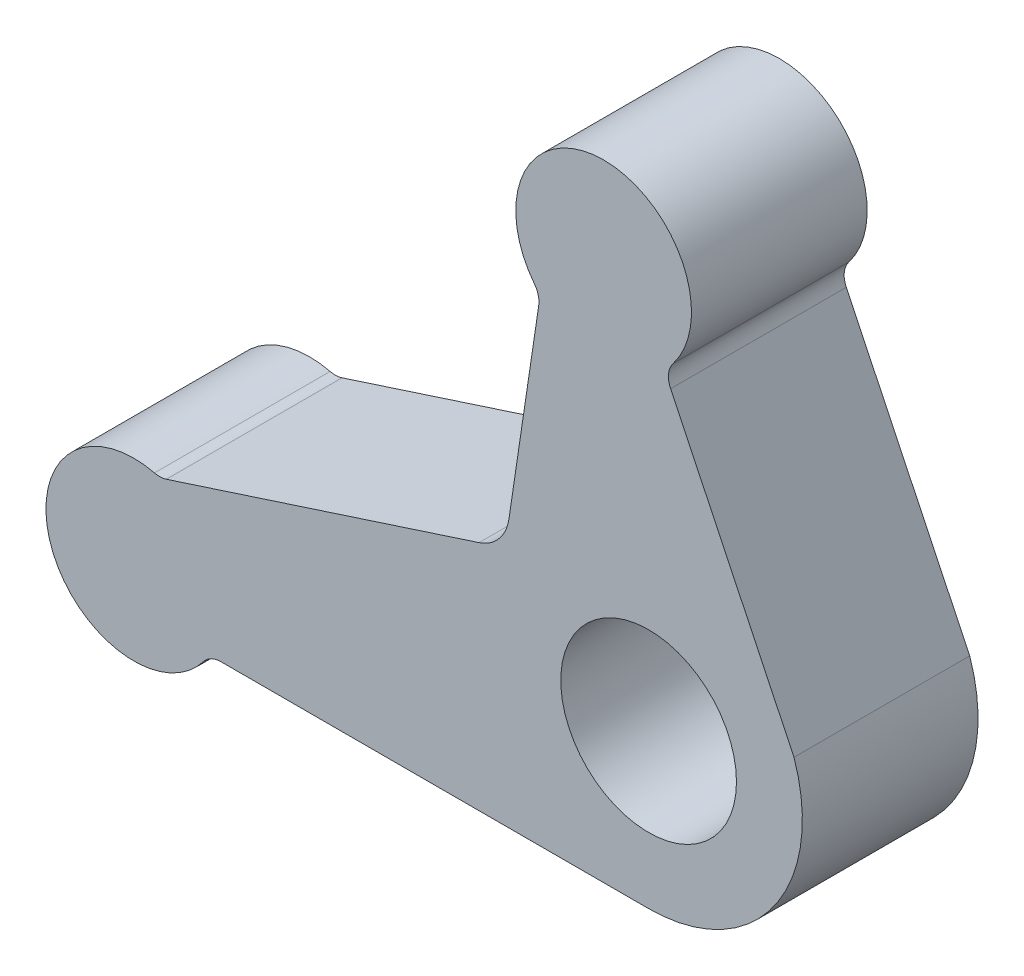
ISO-10303-21;
HEADER;
FILE_DESCRIPTION(('STEP AP214'),'2;1');
FILE_NAME('part.step','',(''),(''),'','','');
FILE_SCHEMA(('AUTOMOTIVE_DESIGN { 1 0 10303 214 1 1 1 1 }'));
ENDSEC;
DATA;
#1=APPLICATION_CONTEXT('core data for automotive mechanical design processes');
#2=APPLICATION_PROTOCOL_DEFINITION('international standard','automotive_design',2000,#1);
#3=PRODUCT_CONTEXT('',#1,'mechanical');
#4=PRODUCT('Part','Part','',(#3));
#5=PRODUCT_RELATED_PRODUCT_CATEGORY('part','',(#4));
#6=PRODUCT_DEFINITION_FORMATION('','',#4);
#7=PRODUCT_DEFINITION_CONTEXT('part definition',#1,'design');
#8=PRODUCT_DEFINITION('design','',#6,#7);
#9=PRODUCT_DEFINITION_SHAPE('','',#8);
#10=(LENGTH_UNIT() NAMED_UNIT(*) SI_UNIT(.MILLI.,.METRE.));
#11=(NAMED_UNIT(*) PLANE_ANGLE_UNIT() SI_UNIT($,.RADIAN.));
#12=(NAMED_UNIT(*) SI_UNIT($,.STERADIAN.) SOLID_ANGLE_UNIT());
#13=UNCERTAINTY_MEASURE_WITH_UNIT(LENGTH_MEASURE(1.E-05),#10,'distance_accuracy_value','');
#14=(GEOMETRIC_REPRESENTATION_CONTEXT(3) GLOBAL_UNCERTAINTY_ASSIGNED_CONTEXT((#13)) GLOBAL_UNIT_ASSIGNED_CONTEXT((#10,
#11,#12)) REPRESENTATION_CONTEXT('',''));
#15=CARTESIAN_POINT('',(0.,0.,0.));
#16=DIRECTION('',(0.,0.,1.));
#17=DIRECTION('',(1.,0.,0.));
#18=AXIS2_PLACEMENT_3D('',#15,#16,#17);
#19=CARTESIAN_POINT('',(-4.16892738689412,2.7368026207029,4.));
#20=DIRECTION('',(0.,0.,-1.));
#21=DIRECTION('',(-1.,0.,0.));
#22=AXIS2_PLACEMENT_3D('',#19,#20,#21);
#23=PLANE('',#22);
#24=CARTESIAN_POINT('',(-4.16892738689412,2.7368026207029,4.));
#25=DIRECTION('',(0.,0.,-1.));
#26=DIRECTION('',(-1.,0.,0.));
#27=AXIS2_PLACEMENT_3D('',#24,#25,#26);
#28=CIRCLE('',#27,1.);
#29=CARTESIAN_POINT('',(-3.1798525093902,2.58938862309552,4.));
#30=VERTEX_POINT('',#29);
#31=CARTESIAN_POINT('',(-3.86030296037079,1.78561864094234,4.));
#32=VERTEX_POINT('',#31);
#33=EDGE_CURVE('E172',#30,#32,#28,.T.);
#34=ORIENTED_EDGE('',*,*,#33,.T.);
#35=DIRECTION('',(0.951183979760563,0.308624426523335,0.));
#36=VECTOR('',#35,1.);
#37=CARTESIAN_POINT('',(-10.9785336563291,-0.523986980205666,4.));
#38=LINE('',#37,#36);
#39=CARTESIAN_POINT('',(-10.9785336563291,-0.523986980205664,4.));
#40=VERTEX_POINT('',#39);
#41=EDGE_CURVE('E128',#40,#32,#38,.T.);
#42=ORIENTED_EDGE('',*,*,#41,.F.);
#43=CARTESIAN_POINT('',(-11.1328458695908,-0.0483949903253829,4.));
#44=DIRECTION('',(0.,0.,1.));
#45=DIRECTION('',(1.,0.,0.));
#46=AXIS2_PLACEMENT_3D('',#43,#44,#45);
#47=CIRCLE('',#46,0.500000000000001);
#48=CARTESIAN_POINT('',(-11.2501785674219,-0.534433093790195,4.));
#49=VERTEX_POINT('',#48);
#50=EDGE_CURVE('E175',#49,#40,#47,.T.);
#51=ORIENTED_EDGE('',*,*,#50,.F.);
#52=CARTESIAN_POINT('',(-11.7195093587463,-2.47858550764944,4.));
#53=DIRECTION('',(0.,0.,1.));
#54=DIRECTION('',(1.,0.,0.));
#55=AXIS2_PLACEMENT_3D('',#52,#53,#54);
#56=CIRCLE('',#55,2.);
#57=CARTESIAN_POINT('',(-10.132502527262,-3.69571710152989,4.));
#58=VERTEX_POINT('',#57);
#59=EDGE_CURVE('E178',#49,#58,#56,.T.);
#60=ORIENTED_EDGE('',*,*,#59,.T.);
#61=CARTESIAN_POINT('',(-9.73575081939088,-4.,4.));
#62=DIRECTION('',(0.,0.,1.));
#63=DIRECTION('',(1.,0.,0.));
#64=AXIS2_PLACEMENT_3D('',#61,#62,#63);
#65=CIRCLE('',#64,0.5);
#66=CARTESIAN_POINT('',(-9.73575081939088,-3.5,4.));
#67=VERTEX_POINT('',#66);
#68=EDGE_CURVE('E181',#67,#58,#65,.T.);
#69=ORIENTED_EDGE('',*,*,#68,.F.);
#70=DIRECTION('',(-1.,0.,0.));
#71=VECTOR('',#70,1.);
#72=CARTESIAN_POINT('',(0.,-3.5,4.));
#73=LINE('',#72,#71);
#74=CARTESIAN_POINT('',(0.,-3.5,4.));
#75=VERTEX_POINT('',#74);
#76=EDGE_CURVE('E184',#75,#67,#73,.T.);
#77=ORIENTED_EDGE('',*,*,#76,.F.);
#78=CARTESIAN_POINT('',(0.,0.,4.));
#79=DIRECTION('',(0.,0.,1.));
#80=DIRECTION('',(1.,0.,0.));
#81=AXIS2_PLACEMENT_3D('',#78,#79,#80);
#82=CIRCLE('',#81,3.5);
#83=CARTESIAN_POINT('',(3.30962135501067,1.13859847464209,4.));
#84=VERTEX_POINT('',#83);
#85=EDGE_CURVE('E187',#75,#84,#82,.T.);
#86=ORIENTED_EDGE('',*,*,#85,.T.);
#87=DIRECTION('',(-0.432249439232411,0.901754080824293,0.));
#88=VECTOR('',#87,1.);
#89=CARTESIAN_POINT('',(3.30962135501067,1.13859847464209,4.));
#90=LINE('',#89,#88);
#91=CARTESIAN_POINT('',(0.499999999999999,7.,4.));
#92=VERTEX_POINT('',#91);
#93=EDGE_CURVE('E190',#84,#92,#90,.T.);
#94=ORIENTED_EDGE('',*,*,#93,.T.);
#95=CARTESIAN_POINT('',(0.950877040412147,7.21612471961621,4.));
#96=DIRECTION('',(0.,0.,1.));
#97=DIRECTION('',(1.,0.,0.));
#98=AXIS2_PLACEMENT_3D('',#95,#96,#97);
#99=CIRCLE('',#98,0.500000000000001);
#100=CARTESIAN_POINT('',(0.555905375993569,7.52271464819577,4.));
#101=VERTEX_POINT('',#100);
#102=EDGE_CURVE('E193',#101,#92,#99,.T.);
#103=ORIENTED_EDGE('',*,*,#102,.F.);
#104=CARTESIAN_POINT('',(-1.02398128168073,8.74907436251401,4.));
#105=DIRECTION('',(0.,0.,1.));
#106=DIRECTION('',(1.,0.,0.));
#107=AXIS2_PLACEMENT_3D('',#104,#105,#106);
#108=CIRCLE('',#107,2.);
#109=CARTESIAN_POINT('',(-2.6018247036547,7.52008691923662,4.));
#110=VERTEX_POINT('',#109);
#111=EDGE_CURVE('E196',#101,#110,#108,.T.);
#112=ORIENTED_EDGE('',*,*,#111,.T.);
#113=CARTESIAN_POINT('',(-2.9962855591482,7.21284005841728,4.));
#114=DIRECTION('',(0.,0.,-1.));
#115=DIRECTION('',(-1.,0.,0.));
#116=AXIS2_PLACEMENT_3D('',#113,#114,#115);
#117=CIRCLE('',#116,0.5);
#118=CARTESIAN_POINT('',(-2.50174812039623,7.13913305961359,4.));
#119=VERTEX_POINT('',#118);
#120=EDGE_CURVE('E199',#110,#119,#117,.T.);
#121=ORIENTED_EDGE('',*,*,#120,.T.);
#122=DIRECTION('',(0.147413997607383,0.989074877503928,0.));
#123=VECTOR('',#122,1.);
#124=CARTESIAN_POINT('',(-3.1798525093902,2.58938862309552,4.));
#125=LINE('',#124,#123);
#126=EDGE_CURVE('E201',#30,#119,#125,.T.);
#127=ORIENTED_EDGE('',*,*,#126,.F.);
#128=EDGE_LOOP('',(#34,#42,#51,#60,#69,#77,#86,#94,#103,#112,#121,#127));
#129=FACE_BOUND('',#128,.T.);
#130=CARTESIAN_POINT('',(0.,0.,4.));
#131=DIRECTION('',(0.,0.,1.));
#132=DIRECTION('',(1.,0.,0.));
#133=AXIS2_PLACEMENT_3D('',#130,#131,#132);
#134=CIRCLE('',#133,2.);
#135=CARTESIAN_POINT('',(2.,0.,4.));
#136=VERTEX_POINT('',#135);
#137=EDGE_CURVE('E136',#136,#136,#134,.T.);
#138=ORIENTED_EDGE('',*,*,#137,.F.);
#139=EDGE_LOOP('',(#138));
#140=FACE_BOUND('',#139,.T.);
#141=ADVANCED_FACE('F33',(#129,#140),#23,.F.);
#142=CARTESIAN_POINT('',(-4.16892738689412,2.7368026207029,0.));
#143=DIRECTION('',(0.,0.,-1.));
#144=DIRECTION('',(-1.,0.,0.));
#145=AXIS2_PLACEMENT_3D('',#142,#143,#144);
#146=PLANE('',#145);
#147=CARTESIAN_POINT('',(-4.16892738689412,2.7368026207029,0.));
#148=DIRECTION('',(0.,0.,-1.));
#149=DIRECTION('',(-1.,0.,0.));
#150=AXIS2_PLACEMENT_3D('',#147,#148,#149);
#151=CIRCLE('',#150,1.);
#152=CARTESIAN_POINT('',(-3.1798525093902,2.58938862309552,0.));
#153=VERTEX_POINT('',#152);
#154=CARTESIAN_POINT('',(-3.86030296037079,1.78561864094234,0.));
#155=VERTEX_POINT('',#154);
#156=EDGE_CURVE('E132',#153,#155,#151,.T.);
#157=ORIENTED_EDGE('',*,*,#156,.F.);
#158=DIRECTION('',(0.147413997607383,0.989074877503928,0.));
#159=VECTOR('',#158,1.);
#160=CARTESIAN_POINT('',(-3.1798525093902,2.58938862309552,0.));
#161=LINE('',#160,#159);
#162=CARTESIAN_POINT('',(-2.50174812039623,7.13913305961359,0.));
#163=VERTEX_POINT('',#162);
#164=EDGE_CURVE('E170',#153,#163,#161,.T.);
#165=ORIENTED_EDGE('',*,*,#164,.T.);
#166=CARTESIAN_POINT('',(-2.9962855591482,7.21284005841728,0.));
#167=DIRECTION('',(0.,0.,-1.));
#168=DIRECTION('',(-1.,0.,0.));
#169=AXIS2_PLACEMENT_3D('',#166,#167,#168);
#170=CIRCLE('',#169,0.5);
#171=CARTESIAN_POINT('',(-2.6018247036547,7.52008691923662,0.));
#172=VERTEX_POINT('',#171);
#173=EDGE_CURVE('E168',#172,#163,#170,.T.);
#174=ORIENTED_EDGE('',*,*,#173,.F.);
#175=CARTESIAN_POINT('',(-1.02398128168073,8.74907436251401,0.));
#176=DIRECTION('',(0.,0.,1.));
#177=DIRECTION('',(1.,0.,0.));
#178=AXIS2_PLACEMENT_3D('',#175,#176,#177);
#179=CIRCLE('',#178,2.);
#180=CARTESIAN_POINT('',(0.555905375993569,7.52271464819577,0.));
#181=VERTEX_POINT('',#180);
#182=EDGE_CURVE('E165',#181,#172,#179,.T.);
#183=ORIENTED_EDGE('',*,*,#182,.F.);
#184=CARTESIAN_POINT('',(0.950877040412147,7.21612471961621,0.));
#185=DIRECTION('',(0.,0.,1.));
#186=DIRECTION('',(1.,0.,0.));
#187=AXIS2_PLACEMENT_3D('',#184,#185,#186);
#188=CIRCLE('',#187,0.500000000000001);
#189=CARTESIAN_POINT('',(0.499999999999999,7.,0.));
#190=VERTEX_POINT('',#189);
#191=EDGE_CURVE('E162',#181,#190,#188,.T.);
#192=ORIENTED_EDGE('',*,*,#191,.T.);
#193=DIRECTION('',(-0.432249439232411,0.901754080824293,0.));
#194=VECTOR('',#193,1.);
#195=CARTESIAN_POINT('',(3.30962135501067,1.13859847464209,0.));
#196=LINE('',#195,#194);
#197=CARTESIAN_POINT('',(3.30962135501067,1.13859847464209,0.));
#198=VERTEX_POINT('',#197);
#199=EDGE_CURVE('E159',#198,#190,#196,.T.);
#200=ORIENTED_EDGE('',*,*,#199,.F.);
#201=CARTESIAN_POINT('',(0.,0.,0.));
#202=DIRECTION('',(0.,0.,1.));
#203=DIRECTION('',(1.,0.,0.));
#204=AXIS2_PLACEMENT_3D('',#201,#202,#203);
#205=CIRCLE('',#204,3.5);
#206=CARTESIAN_POINT('',(0.,-3.5,0.));
#207=VERTEX_POINT('',#206);
#208=EDGE_CURVE('E156',#207,#198,#205,.T.);
#209=ORIENTED_EDGE('',*,*,#208,.F.);
#210=DIRECTION('',(-1.,0.,0.));
#211=VECTOR('',#210,1.);
#212=CARTESIAN_POINT('',(0.,-3.5,0.));
#213=LINE('',#212,#211);
#214=CARTESIAN_POINT('',(-9.73575081939088,-3.5,0.));
#215=VERTEX_POINT('',#214);
#216=EDGE_CURVE('E153',#207,#215,#213,.T.);
#217=ORIENTED_EDGE('',*,*,#216,.T.);
#218=CARTESIAN_POINT('',(-9.73575081939088,-4.,0.));
#219=DIRECTION('',(0.,0.,1.));
#220=DIRECTION('',(1.,0.,0.));
#221=AXIS2_PLACEMENT_3D('',#218,#219,#220);
#222=CIRCLE('',#221,0.5);
#223=CARTESIAN_POINT('',(-10.132502527262,-3.69571710152989,0.));
#224=VERTEX_POINT('',#223);
#225=EDGE_CURVE('E150',#215,#224,#222,.T.);
#226=ORIENTED_EDGE('',*,*,#225,.T.);
#227=CARTESIAN_POINT('',(-11.7195093587463,-2.47858550764944,0.));
#228=DIRECTION('',(0.,0.,1.));
#229=DIRECTION('',(1.,0.,0.));
#230=AXIS2_PLACEMENT_3D('',#227,#228,#229);
#231=CIRCLE('',#230,2.);
#232=CARTESIAN_POINT('',(-11.2501785674219,-0.534433093790195,0.));
#233=VERTEX_POINT('',#232);
#234=EDGE_CURVE('E144',#233,#224,#231,.T.);
#235=ORIENTED_EDGE('',*,*,#234,.F.);
#236=CARTESIAN_POINT('',(-11.1328458695908,-0.0483949903253829,0.));
#237=DIRECTION('',(0.,0.,1.));
#238=DIRECTION('',(1.,0.,0.));
#239=AXIS2_PLACEMENT_3D('',#236,#237,#238);
#240=CIRCLE('',#239,0.500000000000001);
#241=CARTESIAN_POINT('',(-10.9785336563291,-0.523986980205664,0.));
#242=VERTEX_POINT('',#241);
#243=EDGE_CURVE('E142',#233,#242,#240,.T.);
#244=ORIENTED_EDGE('',*,*,#243,.T.);
#245=DIRECTION('',(0.951183979760563,0.308624426523335,0.));
#246=VECTOR('',#245,1.);
#247=CARTESIAN_POINT('',(-10.9785336563291,-0.523986980205666,0.));
#248=LINE('',#247,#246);
#249=EDGE_CURVE('E125',#242,#155,#248,.T.);
#250=ORIENTED_EDGE('',*,*,#249,.T.);
#251=EDGE_LOOP('',(#157,#165,#174,#183,#192,#200,#209,#217,#226,#235,#244,#250));
#252=FACE_BOUND('',#251,.T.);
#253=CARTESIAN_POINT('',(0.,0.,0.));
#254=DIRECTION('',(0.,0.,1.));
#255=DIRECTION('',(1.,0.,0.));
#256=AXIS2_PLACEMENT_3D('',#253,#254,#255);
#257=CIRCLE('',#256,2.);
#258=CARTESIAN_POINT('',(2.,0.,0.));
#259=VERTEX_POINT('',#258);
#260=EDGE_CURVE('E381',#259,#259,#257,.T.);
#261=ORIENTED_EDGE('',*,*,#260,.T.);
#262=EDGE_LOOP('',(#261));
#263=FACE_BOUND('',#262,.T.);
#264=ADVANCED_FACE('F138',(#252,#263),#146,.T.);
#265=CARTESIAN_POINT('',(-4.16892738689412,2.7368026207029,4.));
#266=DIRECTION('',(0.,0.,-1.));
#267=DIRECTION('',(-1.,0.,0.));
#268=AXIS2_PLACEMENT_3D('',#265,#266,#267);
#269=CYLINDRICAL_SURFACE('',#268,1.);
#270=DIRECTION('',(0.,0.,-1.));
#271=VECTOR('',#270,1.);
#272=CARTESIAN_POINT('',(-3.86030296037079,1.78561864094234,4.));
#273=LINE('',#272,#271);
#274=EDGE_CURVE('E11',#32,#155,#273,.T.);
#275=ORIENTED_EDGE('',*,*,#274,.F.);
#276=ORIENTED_EDGE('',*,*,#33,.F.);
#277=DIRECTION('',(0.,0.,-1.));
#278=VECTOR('',#277,1.);
#279=CARTESIAN_POINT('',(-3.1798525093902,2.58938862309552,4.));
#280=LINE('',#279,#278);
#281=EDGE_CURVE('E48',#30,#153,#280,.T.);
#282=ORIENTED_EDGE('',*,*,#281,.T.);
#283=ORIENTED_EDGE('',*,*,#156,.T.);
#284=EDGE_LOOP('',(#275,#276,#282,#283));
#285=FACE_BOUND('',#284,.T.);
#286=ADVANCED_FACE('F133',(#285),#269,.F.);
#287=CARTESIAN_POINT('',(-10.9785336563291,-0.523986980205666,4.));
#288=DIRECTION('',(-0.308624426523335,0.951183979760563,0.));
#289=DIRECTION('',(-0.951183979760563,-0.308624426523335,0.));
#290=AXIS2_PLACEMENT_3D('',#287,#288,#289);
#291=PLANE('',#290);
#292=DIRECTION('',(0.,0.,-1.));
#293=VECTOR('',#292,1.);
#294=CARTESIAN_POINT('',(-10.9785336563291,-0.523986980205664,4.));
#295=LINE('',#294,#293);
#296=EDGE_CURVE('E41',#40,#242,#295,.T.);
#297=ORIENTED_EDGE('',*,*,#296,.F.);
#298=ORIENTED_EDGE('',*,*,#41,.T.);
#299=ORIENTED_EDGE('',*,*,#274,.T.);
#300=ORIENTED_EDGE('',*,*,#249,.F.);
#301=EDGE_LOOP('',(#297,#298,#299,#300));
#302=FACE_BOUND('',#301,.T.);
#303=ADVANCED_FACE('F35',(#302),#291,.T.);
#304=CARTESIAN_POINT('',(-11.1328458695908,-0.0483949903253829,4.));
#305=DIRECTION('',(0.,0.,-1.));
#306=DIRECTION('',(-1.,0.,0.));
#307=AXIS2_PLACEMENT_3D('',#304,#305,#306);
#308=CYLINDRICAL_SURFACE('',#307,0.500000000000001);
#309=DIRECTION('',(0.,0.,-1.));
#310=VECTOR('',#309,1.);
#311=CARTESIAN_POINT('',(-11.2501785674219,-0.534433093790195,4.));
#312=LINE('',#311,#310);
#313=EDGE_CURVE('E219',#49,#233,#312,.T.);
#314=ORIENTED_EDGE('',*,*,#313,.F.);
#315=ORIENTED_EDGE('',*,*,#50,.T.);
#316=ORIENTED_EDGE('',*,*,#296,.T.);
#317=ORIENTED_EDGE('',*,*,#243,.F.);
#318=EDGE_LOOP('',(#314,#315,#316,#317));
#319=FACE_BOUND('',#318,.T.);
#320=ADVANCED_FACE('F221',(#319),#308,.F.);
#321=CARTESIAN_POINT('',(-11.7195093587463,-2.47858550764944,4.));
#322=DIRECTION('',(0.,0.,-1.));
#323=DIRECTION('',(-1.,0.,0.));
#324=AXIS2_PLACEMENT_3D('',#321,#322,#323);
#325=CYLINDRICAL_SURFACE('',#324,2.);
#326=DIRECTION('',(0.,0.,-1.));
#327=VECTOR('',#326,1.);
#328=CARTESIAN_POINT('',(-10.132502527262,-3.69571710152989,4.));
#329=LINE('',#328,#327);
#330=EDGE_CURVE('E217',#58,#224,#329,.T.);
#331=ORIENTED_EDGE('',*,*,#330,.F.);
#332=ORIENTED_EDGE('',*,*,#59,.F.);
#333=ORIENTED_EDGE('',*,*,#313,.T.);
#334=ORIENTED_EDGE('',*,*,#234,.T.);
#335=EDGE_LOOP('',(#331,#332,#333,#334));
#336=FACE_BOUND('',#335,.T.);
#337=ADVANCED_FACE('F255',(#336),#325,.T.);
#338=CARTESIAN_POINT('',(-9.73575081939088,-4.,4.));
#339=DIRECTION('',(0.,0.,-1.));
#340=DIRECTION('',(-1.,0.,0.));
#341=AXIS2_PLACEMENT_3D('',#338,#339,#340);
#342=CYLINDRICAL_SURFACE('',#341,0.5);
#343=DIRECTION('',(0.,0.,-1.));
#344=VECTOR('',#343,1.);
#345=CARTESIAN_POINT('',(-9.73575081939088,-3.5,4.));
#346=LINE('',#345,#344);
#347=EDGE_CURVE('E215',#67,#215,#346,.T.);
#348=ORIENTED_EDGE('',*,*,#347,.F.);
#349=ORIENTED_EDGE('',*,*,#68,.T.);
#350=ORIENTED_EDGE('',*,*,#330,.T.);
#351=ORIENTED_EDGE('',*,*,#225,.F.);
#352=EDGE_LOOP('',(#348,#349,#350,#351));
#353=FACE_BOUND('',#352,.T.);
#354=ADVANCED_FACE('F253',(#353),#342,.F.);
#355=CARTESIAN_POINT('',(0.,-3.5,4.));
#356=DIRECTION('',(0.,-1.,0.));
#357=DIRECTION('',(1.,0.,0.));
#358=AXIS2_PLACEMENT_3D('',#355,#356,#357);
#359=PLANE('',#358);
#360=DIRECTION('',(0.,0.,-1.));
#361=VECTOR('',#360,1.);
#362=CARTESIAN_POINT('',(0.,-3.5,4.));
#363=LINE('',#362,#361);
#364=EDGE_CURVE('E213',#75,#207,#363,.T.);
#365=ORIENTED_EDGE('',*,*,#364,.F.);
#366=ORIENTED_EDGE('',*,*,#76,.T.);
#367=ORIENTED_EDGE('',*,*,#347,.T.);
#368=ORIENTED_EDGE('',*,*,#216,.F.);
#369=EDGE_LOOP('',(#365,#366,#367,#368));
#370=FACE_BOUND('',#369,.T.);
#371=ADVANCED_FACE('F249',(#370),#359,.T.);
#372=CARTESIAN_POINT('',(0.,0.,4.));
#373=DIRECTION('',(0.,0.,-1.));
#374=DIRECTION('',(-1.,0.,0.));
#375=AXIS2_PLACEMENT_3D('',#372,#373,#374);
#376=CYLINDRICAL_SURFACE('',#375,3.5);
#377=DIRECTION('',(0.,0.,-1.));
#378=VECTOR('',#377,1.);
#379=CARTESIAN_POINT('',(3.30962135501067,1.13859847464209,4.));
#380=LINE('',#379,#378);
#381=EDGE_CURVE('E211',#84,#198,#380,.T.);
#382=ORIENTED_EDGE('',*,*,#381,.F.);
#383=ORIENTED_EDGE('',*,*,#85,.F.);
#384=ORIENTED_EDGE('',*,*,#364,.T.);
#385=ORIENTED_EDGE('',*,*,#208,.T.);
#386=EDGE_LOOP('',(#382,#383,#384,#385));
#387=FACE_BOUND('',#386,.T.);
#388=ADVANCED_FACE('F245',(#387),#376,.T.);
#389=CARTESIAN_POINT('',(3.30962135501067,1.13859847464209,4.));
#390=DIRECTION('',(-0.901754080824293,-0.432249439232411,0.));
#391=DIRECTION('',(0.432249439232411,-0.901754080824293,0.));
#392=AXIS2_PLACEMENT_3D('',#389,#390,#391);
#393=PLANE('',#392);
#394=DIRECTION('',(0.,0.,-1.));
#395=VECTOR('',#394,1.);
#396=CARTESIAN_POINT('',(0.499999999999999,7.,4.));
#397=LINE('',#396,#395);
#398=EDGE_CURVE('E209',#92,#190,#397,.T.);
#399=ORIENTED_EDGE('',*,*,#398,.F.);
#400=ORIENTED_EDGE('',*,*,#93,.F.);
#401=ORIENTED_EDGE('',*,*,#381,.T.);
#402=ORIENTED_EDGE('',*,*,#199,.T.);
#403=EDGE_LOOP('',(#399,#400,#401,#402));
#404=FACE_BOUND('',#403,.T.);
#405=ADVANCED_FACE('F241',(#404),#393,.F.);
#406=CARTESIAN_POINT('',(0.950877040412147,7.21612471961621,4.));
#407=DIRECTION('',(0.,0.,-1.));
#408=DIRECTION('',(-1.,0.,0.));
#409=AXIS2_PLACEMENT_3D('',#406,#407,#408);
#410=CYLINDRICAL_SURFACE('',#409,0.500000000000001);
#411=DIRECTION('',(0.,0.,-1.));
#412=VECTOR('',#411,1.);
#413=CARTESIAN_POINT('',(0.555905375993569,7.52271464819577,4.));
#414=LINE('',#413,#412);
#415=EDGE_CURVE('E207',#101,#181,#414,.T.);
#416=ORIENTED_EDGE('',*,*,#415,.F.);
#417=ORIENTED_EDGE('',*,*,#102,.T.);
#418=ORIENTED_EDGE('',*,*,#398,.T.);
#419=ORIENTED_EDGE('',*,*,#191,.F.);
#420=EDGE_LOOP('',(#416,#417,#418,#419));
#421=FACE_BOUND('',#420,.T.);
#422=ADVANCED_FACE('F238',(#421),#410,.F.);
#423=CARTESIAN_POINT('',(-1.02398128168073,8.74907436251401,4.));
#424=DIRECTION('',(0.,0.,-1.));
#425=DIRECTION('',(-1.,0.,0.));
#426=AXIS2_PLACEMENT_3D('',#423,#424,#425);
#427=CYLINDRICAL_SURFACE('',#426,2.);
#428=DIRECTION('',(0.,0.,-1.));
#429=VECTOR('',#428,1.);
#430=CARTESIAN_POINT('',(-2.6018247036547,7.52008691923662,4.));
#431=LINE('',#430,#429);
#432=EDGE_CURVE('E205',#110,#172,#431,.T.);
#433=ORIENTED_EDGE('',*,*,#432,.F.);
#434=ORIENTED_EDGE('',*,*,#111,.F.);
#435=ORIENTED_EDGE('',*,*,#415,.T.);
#436=ORIENTED_EDGE('',*,*,#182,.T.);
#437=EDGE_LOOP('',(#433,#434,#435,#436));
#438=FACE_BOUND('',#437,.T.);
#439=ADVANCED_FACE('F234',(#438),#427,.T.);
#440=CARTESIAN_POINT('',(-2.9962855591482,7.21284005841728,4.));
#441=DIRECTION('',(0.,0.,-1.));
#442=DIRECTION('',(-1.,0.,0.));
#443=AXIS2_PLACEMENT_3D('',#440,#441,#442);
#444=CYLINDRICAL_SURFACE('',#443,0.5);
#445=DIRECTION('',(0.,0.,-1.));
#446=VECTOR('',#445,1.);
#447=CARTESIAN_POINT('',(-2.50174812039623,7.13913305961359,4.));
#448=LINE('',#447,#446);
#449=EDGE_CURVE('E56',#119,#163,#448,.T.);
#450=ORIENTED_EDGE('',*,*,#449,.F.);
#451=ORIENTED_EDGE('',*,*,#120,.F.);
#452=ORIENTED_EDGE('',*,*,#432,.T.);
#453=ORIENTED_EDGE('',*,*,#173,.T.);
#454=EDGE_LOOP('',(#450,#451,#452,#453));
#455=FACE_BOUND('',#454,.T.);
#456=ADVANCED_FACE('F229',(#455),#444,.F.);
#457=CARTESIAN_POINT('',(-3.1798525093902,2.58938862309552,4.));
#458=DIRECTION('',(-0.989074877503928,0.147413997607383,0.));
#459=DIRECTION('',(-0.147413997607383,-0.989074877503928,0.));
#460=AXIS2_PLACEMENT_3D('',#457,#458,#459);
#461=PLANE('',#460);
#462=ORIENTED_EDGE('',*,*,#126,.T.);
#463=ORIENTED_EDGE('',*,*,#449,.T.);
#464=ORIENTED_EDGE('',*,*,#164,.F.);
#465=ORIENTED_EDGE('',*,*,#281,.F.);
#466=EDGE_LOOP('',(#462,#463,#464,#465));
#467=FACE_BOUND('',#466,.T.);
#468=ADVANCED_FACE('F227',(#467),#461,.T.);
#469=CARTESIAN_POINT('',(0.,0.,4.));
#470=DIRECTION('',(0.,0.,-1.));
#471=DIRECTION('',(-1.,0.,0.));
#472=AXIS2_PLACEMENT_3D('',#469,#470,#471);
#473=CYLINDRICAL_SURFACE('',#472,2.);
#474=ORIENTED_EDGE('',*,*,#137,.T.);
#475=EDGE_LOOP('',(#474));
#476=FACE_BOUND('',#475,.T.);
#477=ORIENTED_EDGE('',*,*,#260,.F.);
#478=EDGE_LOOP('',(#477));
#479=FACE_BOUND('',#478,.T.);
#480=ADVANCED_FACE('F275',(#476,#479),#473,.F.);
#481=CLOSED_SHELL('',(#141,#264,#286,#303,#320,#337,#354,#371,#388,#405,#422,#439,#456,#468,#480));
#482=MANIFOLD_SOLID_BREP('B2',#481);
#483=ADVANCED_BREP_SHAPE_REPRESENTATION('',(#18,#482),#14);
#484=SHAPE_DEFINITION_REPRESENTATION(#9,#483);
ENDSEC;
END-ISO-10303-21;
